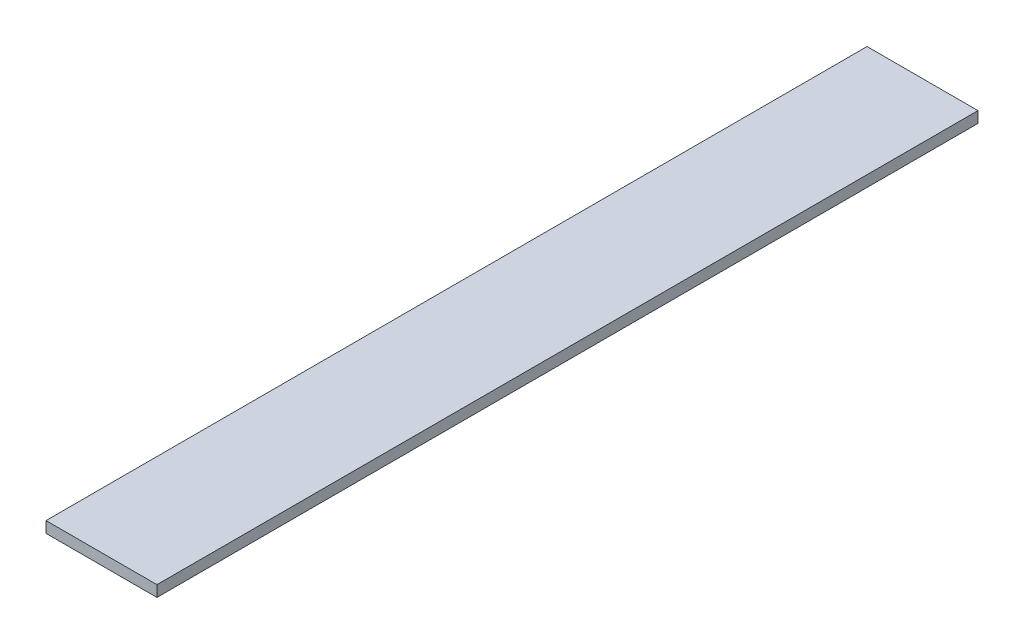
ISO-10303-21;
HEADER;
FILE_DESCRIPTION(('STEP AP214'),'2;1');
FILE_NAME('part.step','',(''),(''),'','','');
FILE_SCHEMA(('AUTOMOTIVE_DESIGN { 1 0 10303 214 1 1 1 1 }'));
ENDSEC;
DATA;
#1=APPLICATION_CONTEXT('core data for automotive mechanical design processes');
#2=APPLICATION_PROTOCOL_DEFINITION('international standard','automotive_design',2000,#1);
#3=PRODUCT_CONTEXT('',#1,'mechanical');
#4=PRODUCT('Part','Part','',(#3));
#5=PRODUCT_RELATED_PRODUCT_CATEGORY('part','',(#4));
#6=PRODUCT_DEFINITION_FORMATION('','',#4);
#7=PRODUCT_DEFINITION_CONTEXT('part definition',#1,'design');
#8=PRODUCT_DEFINITION('design','',#6,#7);
#9=PRODUCT_DEFINITION_SHAPE('','',#8);
#10=(LENGTH_UNIT() NAMED_UNIT(*) SI_UNIT(.MILLI.,.METRE.));
#11=(NAMED_UNIT(*) PLANE_ANGLE_UNIT() SI_UNIT($,.RADIAN.));
#12=(NAMED_UNIT(*) SI_UNIT($,.STERADIAN.) SOLID_ANGLE_UNIT());
#13=UNCERTAINTY_MEASURE_WITH_UNIT(LENGTH_MEASURE(1.E-05),#10,'distance_accuracy_value','');
#14=(GEOMETRIC_REPRESENTATION_CONTEXT(3) GLOBAL_UNCERTAINTY_ASSIGNED_CONTEXT((#13)) GLOBAL_UNIT_ASSIGNED_CONTEXT((#10,
#11,#12)) REPRESENTATION_CONTEXT('',''));
#15=CARTESIAN_POINT('',(0.,0.,0.));
#16=DIRECTION('',(0.,0.,1.));
#17=DIRECTION('',(1.,0.,0.));
#18=AXIS2_PLACEMENT_3D('',#15,#16,#17);
#19=CARTESIAN_POINT('',(0.,6.35,0.));
#20=DIRECTION('',(1.,0.,0.));
#21=DIRECTION('',(0.,0.,-1.));
#22=AXIS2_PLACEMENT_3D('',#19,#20,#21);
#23=PLANE('',#22);
#24=DIRECTION('',(0.,0.,1.));
#25=VECTOR('',#24,1.);
#26=CARTESIAN_POINT('',(0.,0.,0.));
#27=LINE('',#26,#25);
#28=CARTESIAN_POINT('',(0.,0.,-469.9));
#29=VERTEX_POINT('',#28);
#30=CARTESIAN_POINT('',(0.,0.,0.));
#31=VERTEX_POINT('',#30);
#32=EDGE_CURVE('E96',#29,#31,#27,.T.);
#33=ORIENTED_EDGE('',*,*,#32,.T.);
#34=DIRECTION('',(0.,-1.,0.));
#35=VECTOR('',#34,1.);
#36=CARTESIAN_POINT('',(0.,6.35,0.));
#37=LINE('',#36,#35);
#38=CARTESIAN_POINT('',(0.,6.35,0.));
#39=VERTEX_POINT('',#38);
#40=EDGE_CURVE('E11',#39,#31,#37,.T.);
#41=ORIENTED_EDGE('',*,*,#40,.F.);
#42=DIRECTION('',(0.,0.,1.));
#43=VECTOR('',#42,1.);
#44=CARTESIAN_POINT('',(0.,6.35,0.));
#45=LINE('',#44,#43);
#46=CARTESIAN_POINT('',(0.,6.35,-469.9));
#47=VERTEX_POINT('',#46);
#48=EDGE_CURVE('E84',#47,#39,#45,.T.);
#49=ORIENTED_EDGE('',*,*,#48,.F.);
#50=DIRECTION('',(0.,-1.,0.));
#51=VECTOR('',#50,1.);
#52=CARTESIAN_POINT('',(0.,6.35,-469.9));
#53=LINE('',#52,#51);
#54=EDGE_CURVE('E92',#47,#29,#53,.T.);
#55=ORIENTED_EDGE('',*,*,#54,.T.);
#56=EDGE_LOOP('',(#33,#41,#49,#55));
#57=FACE_BOUND('',#56,.T.);
#58=ADVANCED_FACE('F33',(#57),#23,.F.);
#59=CARTESIAN_POINT('',(0.,6.35,0.));
#60=DIRECTION('',(0.,0.,-1.));
#61=DIRECTION('',(-1.,0.,0.));
#62=AXIS2_PLACEMENT_3D('',#59,#60,#61);
#63=PLANE('',#62);
#64=DIRECTION('',(1.,0.,0.));
#65=VECTOR('',#64,1.);
#66=CARTESIAN_POINT('',(0.,0.,0.));
#67=LINE('',#66,#65);
#68=CARTESIAN_POINT('',(63.5,0.,0.));
#69=VERTEX_POINT('',#68);
#70=EDGE_CURVE('E88',#31,#69,#67,.T.);
#71=ORIENTED_EDGE('',*,*,#70,.T.);
#72=DIRECTION('',(0.,-1.,0.));
#73=VECTOR('',#72,1.);
#74=CARTESIAN_POINT('',(63.5,6.35,0.));
#75=LINE('',#74,#73);
#76=CARTESIAN_POINT('',(63.5,6.35,0.));
#77=VERTEX_POINT('',#76);
#78=EDGE_CURVE('E41',#77,#69,#75,.T.);
#79=ORIENTED_EDGE('',*,*,#78,.F.);
#80=DIRECTION('',(1.,0.,0.));
#81=VECTOR('',#80,1.);
#82=CARTESIAN_POINT('',(0.,6.35,0.));
#83=LINE('',#82,#81);
#84=EDGE_CURVE('E79',#39,#77,#83,.T.);
#85=ORIENTED_EDGE('',*,*,#84,.F.);
#86=ORIENTED_EDGE('',*,*,#40,.T.);
#87=EDGE_LOOP('',(#71,#79,#85,#86));
#88=FACE_BOUND('',#87,.T.);
#89=ADVANCED_FACE('F87',(#88),#63,.F.);
#90=CARTESIAN_POINT('',(63.5,6.35,0.));
#91=DIRECTION('',(-1.,0.,0.));
#92=DIRECTION('',(0.,0.,1.));
#93=AXIS2_PLACEMENT_3D('',#90,#91,#92);
#94=PLANE('',#93);
#95=DIRECTION('',(0.,0.,-1.));
#96=VECTOR('',#95,1.);
#97=CARTESIAN_POINT('',(63.5,0.,0.));
#98=LINE('',#97,#96);
#99=CARTESIAN_POINT('',(63.5,0.,-469.9));
#100=VERTEX_POINT('',#99);
#101=EDGE_CURVE('E66',#69,#100,#98,.T.);
#102=ORIENTED_EDGE('',*,*,#101,.T.);
#103=DIRECTION('',(0.,-1.,0.));
#104=VECTOR('',#103,1.);
#105=CARTESIAN_POINT('',(63.5,6.35,-469.9));
#106=LINE('',#105,#104);
#107=CARTESIAN_POINT('',(63.5,6.35,-469.9));
#108=VERTEX_POINT('',#107);
#109=EDGE_CURVE('E89',#108,#100,#106,.T.);
#110=ORIENTED_EDGE('',*,*,#109,.F.);
#111=DIRECTION('',(0.,0.,-1.));
#112=VECTOR('',#111,1.);
#113=CARTESIAN_POINT('',(63.5,6.35,0.));
#114=LINE('',#113,#112);
#115=EDGE_CURVE('E82',#77,#108,#114,.T.);
#116=ORIENTED_EDGE('',*,*,#115,.F.);
#117=ORIENTED_EDGE('',*,*,#78,.T.);
#118=EDGE_LOOP('',(#102,#110,#116,#117));
#119=FACE_BOUND('',#118,.T.);
#120=ADVANCED_FACE('F90',(#119),#94,.F.);
#121=CARTESIAN_POINT('',(0.,6.35,-469.9));
#122=DIRECTION('',(0.,0.,1.));
#123=DIRECTION('',(1.,0.,0.));
#124=AXIS2_PLACEMENT_3D('',#121,#122,#123);
#125=PLANE('',#124);
#126=DIRECTION('',(-1.,0.,0.));
#127=VECTOR('',#126,1.);
#128=CARTESIAN_POINT('',(0.,0.,-469.9));
#129=LINE('',#128,#127);
#130=EDGE_CURVE('E72',#100,#29,#129,.T.);
#131=ORIENTED_EDGE('',*,*,#130,.T.);
#132=ORIENTED_EDGE('',*,*,#54,.F.);
#133=DIRECTION('',(-1.,0.,0.));
#134=VECTOR('',#133,1.);
#135=CARTESIAN_POINT('',(0.,6.35,-469.9));
#136=LINE('',#135,#134);
#137=EDGE_CURVE('E49',#108,#47,#136,.T.);
#138=ORIENTED_EDGE('',*,*,#137,.F.);
#139=ORIENTED_EDGE('',*,*,#109,.T.);
#140=EDGE_LOOP('',(#131,#132,#138,#139));
#141=FACE_BOUND('',#140,.T.);
#142=ADVANCED_FACE('F103',(#141),#125,.F.);
#143=CARTESIAN_POINT('',(0.,6.35,0.));
#144=DIRECTION('',(0.,-1.,0.));
#145=DIRECTION('',(0.,0.,-1.));
#146=AXIS2_PLACEMENT_3D('',#143,#144,#145);
#147=PLANE('',#146);
#148=ORIENTED_EDGE('',*,*,#48,.T.);
#149=ORIENTED_EDGE('',*,*,#84,.T.);
#150=ORIENTED_EDGE('',*,*,#115,.T.);
#151=ORIENTED_EDGE('',*,*,#137,.T.);
#152=EDGE_LOOP('',(#148,#149,#150,#151));
#153=FACE_BOUND('',#152,.T.);
#154=ADVANCED_FACE('F80',(#153),#147,.F.);
#155=CARTESIAN_POINT('',(0.,0.,0.));
#156=DIRECTION('',(0.,-1.,0.));
#157=DIRECTION('',(0.,0.,-1.));
#158=AXIS2_PLACEMENT_3D('',#155,#156,#157);
#159=PLANE('',#158);
#160=ORIENTED_EDGE('',*,*,#32,.F.);
#161=ORIENTED_EDGE('',*,*,#130,.F.);
#162=ORIENTED_EDGE('',*,*,#101,.F.);
#163=ORIENTED_EDGE('',*,*,#70,.F.);
#164=EDGE_LOOP('',(#160,#161,#162,#163));
#165=FACE_BOUND('',#164,.T.);
#166=ADVANCED_FACE('F106',(#165),#159,.T.);
#167=CLOSED_SHELL('',(#58,#89,#120,#142,#154,#166));
#168=MANIFOLD_SOLID_BREP('B2',#167);
#169=ADVANCED_BREP_SHAPE_REPRESENTATION('',(#18,#168),#14);
#170=SHAPE_DEFINITION_REPRESENTATION(#9,#169);
ENDSEC;
END-ISO-10303-21;
